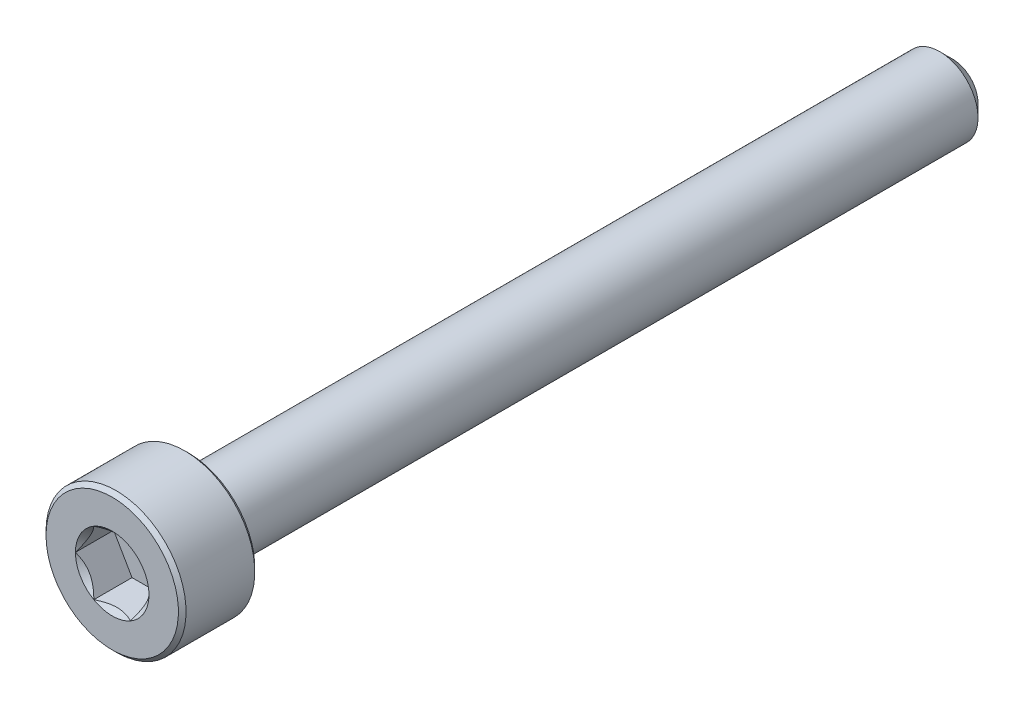
ISO-10303-21;
HEADER;
FILE_DESCRIPTION(('STEP AP214'),'2;1');
FILE_NAME('part.step','',(''),(''),'','','');
FILE_SCHEMA(('AUTOMOTIVE_DESIGN { 1 0 10303 214 1 1 1 1 }'));
ENDSEC;
DATA;
#1=APPLICATION_CONTEXT('core data for automotive mechanical design processes');
#2=APPLICATION_PROTOCOL_DEFINITION('international standard','automotive_design',2000,#1);
#3=PRODUCT_CONTEXT('',#1,'mechanical');
#4=PRODUCT('Part','Part','',(#3));
#5=PRODUCT_RELATED_PRODUCT_CATEGORY('part','',(#4));
#6=PRODUCT_DEFINITION_FORMATION('','',#4);
#7=PRODUCT_DEFINITION_CONTEXT('part definition',#1,'design');
#8=PRODUCT_DEFINITION('design','',#6,#7);
#9=PRODUCT_DEFINITION_SHAPE('','',#8);
#10=(LENGTH_UNIT() NAMED_UNIT(*) SI_UNIT(.MILLI.,.METRE.));
#11=(NAMED_UNIT(*) PLANE_ANGLE_UNIT() SI_UNIT($,.RADIAN.));
#12=(NAMED_UNIT(*) SI_UNIT($,.STERADIAN.) SOLID_ANGLE_UNIT());
#13=UNCERTAINTY_MEASURE_WITH_UNIT(LENGTH_MEASURE(1.E-05),#10,'distance_accuracy_value','');
#14=(GEOMETRIC_REPRESENTATION_CONTEXT(3) GLOBAL_UNCERTAINTY_ASSIGNED_CONTEXT((#13)) GLOBAL_UNIT_ASSIGNED_CONTEXT((#10,
#11,#12)) REPRESENTATION_CONTEXT('',''));
#15=CARTESIAN_POINT('',(0.,0.,0.));
#16=DIRECTION('',(0.,0.,1.));
#17=DIRECTION('',(1.,0.,0.));
#18=AXIS2_PLACEMENT_3D('',#15,#16,#17);
#19=CARTESIAN_POINT('',(1.44337567297406,0.,9.68118692087013));
#20=DIRECTION('',(0.866025403784439,0.5,0.));
#21=DIRECTION('',(0.,0.,-1.));
#22=AXIS2_PLACEMENT_3D('',#19,#20,#21);
#23=PLANE('',#22);
#24=DIRECTION('',(0.,0.,1.));
#25=VECTOR('',#24,1.);
#26=CARTESIAN_POINT('',(1.44337567297406,0.,9.68118692087013));
#27=LINE('',#26,#25);
#28=CARTESIAN_POINT('',(1.44337567297406,0.,15.));
#29=VERTEX_POINT('',#28);
#30=CARTESIAN_POINT('',(1.44337567297406,0.,16.5));
#31=VERTEX_POINT('',#30);
#32=EDGE_CURVE('E11',#29,#31,#27,.T.);
#33=ORIENTED_EDGE('',*,*,#32,.T.);
#34=CARTESIAN_POINT('',(1.44337567297406,0.,16.5));
#35=CARTESIAN_POINT('',(1.41857091071405,0.0429631085040134,16.475219039718));
#36=CARTESIAN_POINT('',(1.39335141059849,0.0866445640456525,16.4518937494627));
#37=CARTESIAN_POINT('',(1.34192626179312,0.175715534563347,16.4091861389099));
#38=CARTESIAN_POINT('',(1.31571572524133,0.22111351556468,16.389827573349));
#39=CARTESIAN_POINT('',(1.26286346737866,0.312656311477564,16.3566662159029));
#40=CARTESIAN_POINT('',(1.2362351986357,0.358777825857971,16.3427800967733));
#41=CARTESIAN_POINT('',(1.18239258914488,0.452035961108158,16.3213859017897));
#42=CARTESIAN_POINT('',(1.15517989206246,0.499169735065894,16.3138618619115));
#43=CARTESIAN_POINT('',(1.10827633065602,0.580409086477772,16.3070728277861));
#44=CARTESIAN_POINT('',(1.08864599684083,0.614409822015219,16.3060681886446));
#45=CARTESIAN_POINT('',(1.0494198823342,0.682351445324215,16.3077634952111));
#46=CARTESIAN_POINT('',(1.02982411023275,0.716292318217467,16.3104642592515));
#47=CARTESIAN_POINT('',(0.990821754325343,0.783846380263978,16.3194142483348));
#48=CARTESIAN_POINT('',(0.971415363536199,0.817459235102312,16.3256667730471));
#49=CARTESIAN_POINT('',(0.932926594125731,0.884123739242045,16.3413835392354));
#50=CARTESIAN_POINT('',(0.913844358232442,0.917175141331236,16.3508491588483));
#51=CARTESIAN_POINT('',(0.864994007906011,1.00178643006415,16.3789283315699));
#52=CARTESIAN_POINT('',(0.835533298508109,1.05281387556834,16.3996493450535));
#53=CARTESIAN_POINT('',(0.777764485738232,1.1528723943787,16.4463235058095));
#54=CARTESIAN_POINT('',(0.749452981901492,1.20190935746262,16.4722596212216));
#55=CARTESIAN_POINT('',(0.721687836487032,1.25,16.5));
#56=B_SPLINE_CURVE_WITH_KNOTS('',3,(#34,#35,#36,#37,#38,#39,#40,#41,#42,#43,#44,#45,#46,#47,#48,
#49,#50,#51,#52,#53,#54,#55),.UNSPECIFIED.,.F.,.F.,(4,2,2,2,2,2,2,2,2,2,4),(0.,
0.166478683225852,0.333926926832843,0.498716658518453,0.663091654628563,0.780745575560545,
0.898425484353585,1.01621489977236,1.13405490052654,1.32111591641585,1.50757565758619),.UNSPECIFIED.);
#57=CARTESIAN_POINT('',(0.721687836487031,1.25,16.5));
#58=VERTEX_POINT('',#57);
#59=EDGE_CURVE('E105',#31,#58,#56,.T.);
#60=ORIENTED_EDGE('',*,*,#59,.T.);
#61=DIRECTION('',(0.,0.,1.));
#62=VECTOR('',#61,1.);
#63=CARTESIAN_POINT('',(0.721687836487032,1.25,9.68118692087013));
#64=LINE('',#63,#62);
#65=CARTESIAN_POINT('',(0.721687836487032,1.25,15.));
#66=VERTEX_POINT('',#65);
#67=EDGE_CURVE('E90',#66,#58,#64,.T.);
#68=ORIENTED_EDGE('',*,*,#67,.F.);
#69=DIRECTION('',(0.5,-0.866025403784439,0.));
#70=VECTOR('',#69,1.);
#71=CARTESIAN_POINT('',(1.44337567297406,0.,15.));
#72=LINE('',#71,#70);
#73=EDGE_CURVE('E110',#66,#29,#72,.T.);
#74=ORIENTED_EDGE('',*,*,#73,.T.);
#75=EDGE_LOOP('',(#33,#60,#68,#74));
#76=FACE_BOUND('',#75,.T.);
#77=ADVANCED_FACE('F17',(#76),#23,.F.);
#78=CARTESIAN_POINT('',(0.721687836487031,-1.25,9.68118692087013));
#79=DIRECTION('',(0.866025403784439,-0.5,0.));
#80=DIRECTION('',(0.,0.,-1.));
#81=AXIS2_PLACEMENT_3D('',#78,#79,#80);
#82=PLANE('',#81);
#83=DIRECTION('',(0.,0.,1.));
#84=VECTOR('',#83,1.);
#85=CARTESIAN_POINT('',(0.721687836487031,-1.25,9.68118692087013));
#86=LINE('',#85,#84);
#87=CARTESIAN_POINT('',(0.721687836487031,-1.25,15.));
#88=VERTEX_POINT('',#87);
#89=CARTESIAN_POINT('',(0.721687836487031,-1.25,16.5));
#90=VERTEX_POINT('',#89);
#91=EDGE_CURVE('E34',#88,#90,#86,.T.);
#92=ORIENTED_EDGE('',*,*,#91,.T.);
#93=CARTESIAN_POINT('',(0.721687836487031,-1.25,16.5));
#94=CARTESIAN_POINT('',(0.746492598747046,-1.20703689149599,16.475219039718));
#95=CARTESIAN_POINT('',(0.771712098862606,-1.16335543595435,16.4518937494627));
#96=CARTESIAN_POINT('',(0.823137247667977,-1.07428446543665,16.4091861389099));
#97=CARTESIAN_POINT('',(0.849347784219762,-1.02888648443532,16.389827573349));
#98=CARTESIAN_POINT('',(0.902200042082436,-0.937343688522439,16.3566662159029));
#99=CARTESIAN_POINT('',(0.928828310825397,-0.891222174142032,16.3427800967733));
#100=CARTESIAN_POINT('',(0.982670920316216,-0.797964038891844,16.3213859017897));
#101=CARTESIAN_POINT('',(1.00988361739864,-0.750830264934109,16.3138618619115));
#102=CARTESIAN_POINT('',(1.05678717880508,-0.66959091352223,16.3070728277861));
#103=CARTESIAN_POINT('',(1.07641751262027,-0.635590177984783,16.3060681886446));
#104=CARTESIAN_POINT('',(1.1156436271269,-0.567648554675787,16.3077634952111));
#105=CARTESIAN_POINT('',(1.13523939922835,-0.533707681782535,16.3104642592515));
#106=CARTESIAN_POINT('',(1.17424175513575,-0.466153619736024,16.3194142483348));
#107=CARTESIAN_POINT('',(1.1936481459249,-0.432540764897689,16.3256667730471));
#108=CARTESIAN_POINT('',(1.23213691533536,-0.365876260757957,16.3413835392354));
#109=CARTESIAN_POINT('',(1.25121915122865,-0.332824858668766,16.3508491588483));
#110=CARTESIAN_POINT('',(1.30006950155508,-0.248213569935849,16.3789283315699));
#111=CARTESIAN_POINT('',(1.32953021095298,-0.19718612443166,16.3996493450535));
#112=CARTESIAN_POINT('',(1.38729902372286,-0.0971276056212983,16.4463235058095));
#113=CARTESIAN_POINT('',(1.4156105275596,-0.0480906425373827,16.4722596212216));
#114=CARTESIAN_POINT('',(1.44337567297406,0.,16.5));
#115=B_SPLINE_CURVE_WITH_KNOTS('',3,(#93,#94,#95,#96,#97,#98,#99,#100,#101,#102,#103,#104,#105,
#106,#107,#108,#109,#110,#111,#112,#113,#114),.UNSPECIFIED.,.F.,.F.,(4,2,2,2,2,2,2,2,2,2,4),(0.,
0.166478683225851,0.333926926832841,0.49871665851845,0.663091654628561,0.780745575560543,
0.898425484353584,1.01621489977236,1.13405490052654,1.32111591641584,1.5075756575862),.UNSPECIFIED.);
#116=EDGE_CURVE('E111',#90,#31,#115,.T.);
#117=ORIENTED_EDGE('',*,*,#116,.T.);
#118=ORIENTED_EDGE('',*,*,#32,.F.);
#119=DIRECTION('',(-0.5,-0.866025403784438,0.));
#120=VECTOR('',#119,1.);
#121=CARTESIAN_POINT('',(0.721687836487031,-1.25,15.));
#122=LINE('',#121,#120);
#123=EDGE_CURVE('E102',#29,#88,#122,.T.);
#124=ORIENTED_EDGE('',*,*,#123,.T.);
#125=EDGE_LOOP('',(#92,#117,#118,#124));
#126=FACE_BOUND('',#125,.T.);
#127=ADVANCED_FACE('F232',(#126),#82,.F.);
#128=CARTESIAN_POINT('',(-0.721687836487033,-1.25,9.68118692087013));
#129=DIRECTION('',(0.,-1.,0.));
#130=DIRECTION('',(-1.,0.,0.));
#131=AXIS2_PLACEMENT_3D('',#128,#129,#130);
#132=PLANE('',#131);
#133=DIRECTION('',(0.,0.,1.));
#134=VECTOR('',#133,1.);
#135=CARTESIAN_POINT('',(-0.721687836487033,-1.25,9.68118692087013));
#136=LINE('',#135,#134);
#137=CARTESIAN_POINT('',(-0.721687836487033,-1.25,15.));
#138=VERTEX_POINT('',#137);
#139=CARTESIAN_POINT('',(-0.721687836487033,-1.25,16.5));
#140=VERTEX_POINT('',#139);
#141=EDGE_CURVE('E150',#138,#140,#136,.T.);
#142=ORIENTED_EDGE('',*,*,#141,.T.);
#143=CARTESIAN_POINT('',(-0.721687836487033,-1.25,16.5));
#144=CARTESIAN_POINT('',(-0.672078311967002,-1.25,16.475219039718));
#145=CARTESIAN_POINT('',(-0.621639311735882,-1.25,16.4518937494627));
#146=CARTESIAN_POINT('',(-0.518789014125139,-1.25,16.4091861389099));
#147=CARTESIAN_POINT('',(-0.46636794102157,-1.25,16.389827573349));
#148=CARTESIAN_POINT('',(-0.360663425296221,-1.25,16.3566662159029));
#149=CARTESIAN_POINT('',(-0.307406887810299,-1.25,16.3427800967733));
#150=CARTESIAN_POINT('',(-0.199721668828662,-1.25,16.3213859017897));
#151=CARTESIAN_POINT('',(-0.145296274663819,-1.25,16.3138618619115));
#152=CARTESIAN_POINT('',(-0.0514891518509423,-1.25,16.3070728277861));
#153=CARTESIAN_POINT('',(-0.0122284842205616,-1.25,16.3060681886446));
#154=CARTESIAN_POINT('',(0.0662237447926961,-1.25,16.3077634952111));
#155=CARTESIAN_POINT('',(0.105415288995596,-1.25,16.3104642592515));
#156=CARTESIAN_POINT('',(0.183420000810408,-1.25,16.3194142483348));
#157=CARTESIAN_POINT('',(0.222232782388696,-1.25,16.3256667730471));
#158=CARTESIAN_POINT('',(0.299210321209632,-1.25,16.3413835392354));
#159=CARTESIAN_POINT('',(0.33737479299621,-1.25,16.3508491588483));
#160=CARTESIAN_POINT('',(0.435075493649071,-1.25,16.3789283315699));
#161=CARTESIAN_POINT('',(0.493996912444875,-1.25,16.3996493450535));
#162=CARTESIAN_POINT('',(0.60953453798463,-1.25,16.4463235058095));
#163=CARTESIAN_POINT('',(0.666157545658111,-1.25,16.4722596212216));
#164=CARTESIAN_POINT('',(0.721687836487031,-1.25,16.5));
#165=B_SPLINE_CURVE_WITH_KNOTS('',3,(#143,#144,#145,#146,#147,#148,#149,#150,#151,#152,#153,
#154,#155,#156,#157,#158,#159,#160,#161,#162,#163,#164),.UNSPECIFIED.,.F.,.F.,(4,2,2,2,2,2,2,2,
2,2,4),(0.,0.166478683225852,0.333926926832842,0.498716658518451,0.663091654628561,
0.780745575560543,0.898425484353584,1.01621489977236,1.13405490052654,1.32111591641584,
1.50757565758619),.UNSPECIFIED.);
#166=EDGE_CURVE('E223',#140,#90,#165,.T.);
#167=ORIENTED_EDGE('',*,*,#166,.T.);
#168=ORIENTED_EDGE('',*,*,#91,.F.);
#169=DIRECTION('',(-1.,0.,0.));
#170=VECTOR('',#169,1.);
#171=CARTESIAN_POINT('',(-0.721687836487033,-1.25,15.));
#172=LINE('',#171,#170);
#173=EDGE_CURVE('E432',#88,#138,#172,.T.);
#174=ORIENTED_EDGE('',*,*,#173,.T.);
#175=EDGE_LOOP('',(#142,#167,#168,#174));
#176=FACE_BOUND('',#175,.T.);
#177=ADVANCED_FACE('F229',(#176),#132,.F.);
#178=CARTESIAN_POINT('',(-1.44337567297406,0.,9.68118692087013));
#179=DIRECTION('',(-0.866025403784439,-0.5,0.));
#180=DIRECTION('',(-0.5,0.866025403784439,0.));
#181=AXIS2_PLACEMENT_3D('',#178,#179,#180);
#182=PLANE('',#181);
#183=DIRECTION('',(0.,0.,1.));
#184=VECTOR('',#183,1.);
#185=CARTESIAN_POINT('',(-1.44337567297406,0.,9.68118692087013));
#186=LINE('',#185,#184);
#187=CARTESIAN_POINT('',(-1.44337567297406,0.,15.));
#188=VERTEX_POINT('',#187);
#189=CARTESIAN_POINT('',(-1.44337567297406,0.,16.5));
#190=VERTEX_POINT('',#189);
#191=EDGE_CURVE('E157',#188,#190,#186,.T.);
#192=ORIENTED_EDGE('',*,*,#191,.T.);
#193=CARTESIAN_POINT('',(-1.44337567297406,0.,16.5));
#194=CARTESIAN_POINT('',(-1.41857091071405,-0.0429631085040118,16.475219039718));
#195=CARTESIAN_POINT('',(-1.39335141059849,-0.0866445640456508,16.4518937494627));
#196=CARTESIAN_POINT('',(-1.34192626179312,-0.175715534563344,16.4091861389099));
#197=CARTESIAN_POINT('',(-1.31571572524133,-0.221113515564677,16.389827573349));
#198=CARTESIAN_POINT('',(-1.26286346737866,-0.312656311477561,16.3566662159029));
#199=CARTESIAN_POINT('',(-1.2362351986357,-0.358777825857967,16.3427800967733));
#200=CARTESIAN_POINT('',(-1.18239258914488,-0.452035961108155,16.3213859017897));
#201=CARTESIAN_POINT('',(-1.15517989206246,-0.499169735065891,16.3138618619115));
#202=CARTESIAN_POINT('',(-1.10827633065602,-0.580409086477769,16.3070728277861));
#203=CARTESIAN_POINT('',(-1.08864599684083,-0.614409822015216,16.3060681886446));
#204=CARTESIAN_POINT('',(-1.0494198823342,-0.682351445324212,16.3077634952111));
#205=CARTESIAN_POINT('',(-1.02982411023275,-0.716292318217464,16.3104642592515));
#206=CARTESIAN_POINT('',(-0.990821754325344,-0.783846380263975,16.3194142483348));
#207=CARTESIAN_POINT('',(-0.9714153635362,-0.81745923510231,16.3256667730471));
#208=CARTESIAN_POINT('',(-0.932926594125732,-0.884123739242042,16.3413835392354));
#209=CARTESIAN_POINT('',(-0.913844358232443,-0.917175141331233,16.3508491588483));
#210=CARTESIAN_POINT('',(-0.864994007906013,-1.00178643006415,16.3789283315699));
#211=CARTESIAN_POINT('',(-0.83553329850811,-1.05281387556834,16.3996493450535));
#212=CARTESIAN_POINT('',(-0.777764485738232,-1.1528723943787,16.4463235058095));
#213=CARTESIAN_POINT('',(-0.749452981901492,-1.20190935746262,16.4722596212216));
#214=CARTESIAN_POINT('',(-0.721687836487032,-1.25,16.5));
#215=B_SPLINE_CURVE_WITH_KNOTS('',3,(#193,#194,#195,#196,#197,#198,#199,#200,#201,#202,#203,
#204,#205,#206,#207,#208,#209,#210,#211,#212,#213,#214),.UNSPECIFIED.,.F.,.F.,(4,2,2,2,2,2,2,2,
2,2,4),(0.,0.166478683225851,0.333926926832841,0.498716658518451,0.663091654628561,
0.780745575560544,0.898425484353584,1.01621489977236,1.13405490052654,1.32111591641584,
1.5075756575862),.UNSPECIFIED.);
#216=EDGE_CURVE('E207',#190,#140,#215,.T.);
#217=ORIENTED_EDGE('',*,*,#216,.T.);
#218=ORIENTED_EDGE('',*,*,#141,.F.);
#219=DIRECTION('',(-0.5,0.866025403784439,0.));
#220=VECTOR('',#219,1.);
#221=CARTESIAN_POINT('',(-1.44337567297406,0.,15.));
#222=LINE('',#221,#220);
#223=EDGE_CURVE('E429',#138,#188,#222,.T.);
#224=ORIENTED_EDGE('',*,*,#223,.T.);
#225=EDGE_LOOP('',(#192,#217,#218,#224));
#226=FACE_BOUND('',#225,.T.);
#227=ADVANCED_FACE('F195',(#226),#182,.F.);
#228=CARTESIAN_POINT('',(-0.721687836487032,1.25,9.68118692087013));
#229=DIRECTION('',(-0.866025403784439,0.5,0.));
#230=DIRECTION('',(0.,0.,1.));
#231=AXIS2_PLACEMENT_3D('',#228,#229,#230);
#232=PLANE('',#231);
#233=DIRECTION('',(0.,0.,1.));
#234=VECTOR('',#233,1.);
#235=CARTESIAN_POINT('',(-0.721687836487032,1.25,9.68118692087013));
#236=LINE('',#235,#234);
#237=CARTESIAN_POINT('',(-0.721687836487032,1.25,15.));
#238=VERTEX_POINT('',#237);
#239=CARTESIAN_POINT('',(-0.721687836487031,1.25,16.5));
#240=VERTEX_POINT('',#239);
#241=EDGE_CURVE('E101',#238,#240,#236,.T.);
#242=ORIENTED_EDGE('',*,*,#241,.T.);
#243=CARTESIAN_POINT('',(-0.721687836487032,1.25,16.5));
#244=CARTESIAN_POINT('',(-0.746492598747047,1.20703689149599,16.475219039718));
#245=CARTESIAN_POINT('',(-0.771712098862607,1.16335543595435,16.4518937494627));
#246=CARTESIAN_POINT('',(-0.823137247667979,1.07428446543665,16.4091861389099));
#247=CARTESIAN_POINT('',(-0.849347784219764,1.02888648443532,16.389827573349));
#248=CARTESIAN_POINT('',(-0.902200042082438,0.937343688522437,16.3566662159029));
#249=CARTESIAN_POINT('',(-0.928828310825399,0.89122217414203,16.3427800967733));
#250=CARTESIAN_POINT('',(-0.982670920316218,0.797964038891842,16.3213859017897));
#251=CARTESIAN_POINT('',(-1.00988361739864,0.750830264934106,16.3138618619115));
#252=CARTESIAN_POINT('',(-1.05678717880508,0.669590913522227,16.3070728277861));
#253=CARTESIAN_POINT('',(-1.07641751262027,0.63559017798478,16.3060681886446));
#254=CARTESIAN_POINT('',(-1.1156436271269,0.567648554675784,16.3077634952111));
#255=CARTESIAN_POINT('',(-1.13523939922835,0.533707681782532,16.3104642592515));
#256=CARTESIAN_POINT('',(-1.17424175513575,0.466153619736021,16.3194142483348));
#257=CARTESIAN_POINT('',(-1.1936481459249,0.432540764897686,16.3256667730471));
#258=CARTESIAN_POINT('',(-1.23213691533537,0.365876260757954,16.3413835392354));
#259=CARTESIAN_POINT('',(-1.25121915122865,0.332824858668762,16.3508491588483));
#260=CARTESIAN_POINT('',(-1.30006950155509,0.248213569935846,16.3789283315699));
#261=CARTESIAN_POINT('',(-1.32953021095299,0.197186124431659,16.3996493450535));
#262=CARTESIAN_POINT('',(-1.38729902372286,0.0971276056212985,16.4463235058095));
#263=CARTESIAN_POINT('',(-1.4156105275596,0.0480906425373836,16.4722596212216));
#264=CARTESIAN_POINT('',(-1.44337567297406,0.,16.5));
#265=B_SPLINE_CURVE_WITH_KNOTS('',3,(#243,#244,#245,#246,#247,#248,#249,#250,#251,#252,#253,
#254,#255,#256,#257,#258,#259,#260,#261,#262,#263,#264),.UNSPECIFIED.,.F.,.F.,(4,2,2,2,2,2,2,2,
2,2,4),(0.,0.166478683225852,0.333926926832843,0.498716658518452,0.663091654628565,
0.780745575560547,0.898425484353588,1.01621489977237,1.13405490052655,1.32111591641584,
1.50757565758619),.UNSPECIFIED.);
#266=EDGE_CURVE('E119',#240,#190,#265,.T.);
#267=ORIENTED_EDGE('',*,*,#266,.T.);
#268=ORIENTED_EDGE('',*,*,#191,.F.);
#269=DIRECTION('',(0.5,0.866025403784439,0.));
#270=VECTOR('',#269,1.);
#271=CARTESIAN_POINT('',(-0.721687836487032,1.25,15.));
#272=LINE('',#271,#270);
#273=EDGE_CURVE('E433',#188,#238,#272,.T.);
#274=ORIENTED_EDGE('',*,*,#273,.T.);
#275=EDGE_LOOP('',(#242,#267,#268,#274));
#276=FACE_BOUND('',#275,.T.);
#277=ADVANCED_FACE('F191',(#276),#232,.F.);
#278=CARTESIAN_POINT('',(0.721687836487032,1.25,9.68118692087013));
#279=DIRECTION('',(0.,1.,0.));
#280=DIRECTION('',(1.,0.,0.));
#281=AXIS2_PLACEMENT_3D('',#278,#279,#280);
#282=PLANE('',#281);
#283=ORIENTED_EDGE('',*,*,#67,.T.);
#284=CARTESIAN_POINT('',(0.721687836487031,1.25,16.5));
#285=CARTESIAN_POINT('',(0.672078311967001,1.25,16.475219039718));
#286=CARTESIAN_POINT('',(0.621639311735882,1.25,16.4518937494627));
#287=CARTESIAN_POINT('',(0.518789014125139,1.25,16.4091861389099));
#288=CARTESIAN_POINT('',(0.466367941021569,1.25,16.389827573349));
#289=CARTESIAN_POINT('',(0.360663425296221,1.25,16.3566662159029));
#290=CARTESIAN_POINT('',(0.307406887810299,1.25,16.3427800967733));
#291=CARTESIAN_POINT('',(0.199721668828662,1.25,16.3213859017897));
#292=CARTESIAN_POINT('',(0.14529627466382,1.25,16.3138618619115));
#293=CARTESIAN_POINT('',(0.0514891518509428,1.25,16.3070728277861));
#294=CARTESIAN_POINT('',(0.012228484220562,1.25,16.3060681886446));
#295=CARTESIAN_POINT('',(-0.0662237447926957,1.25,16.3077634952111));
#296=CARTESIAN_POINT('',(-0.105415288995596,1.25,16.3104642592515));
#297=CARTESIAN_POINT('',(-0.183420000810408,1.25,16.3194142483348));
#298=CARTESIAN_POINT('',(-0.222232782388696,1.25,16.3256667730471));
#299=CARTESIAN_POINT('',(-0.299210321209631,1.25,16.3413835392354));
#300=CARTESIAN_POINT('',(-0.337374792996209,1.25,16.3508491588483));
#301=CARTESIAN_POINT('',(-0.435075493649071,1.25,16.3789283315699));
#302=CARTESIAN_POINT('',(-0.493996912444875,1.25,16.3996493450535));
#303=CARTESIAN_POINT('',(-0.60953453798463,1.25,16.4463235058095));
#304=CARTESIAN_POINT('',(-0.666157545658111,1.25,16.4722596212216));
#305=CARTESIAN_POINT('',(-0.721687836487031,1.25,16.5));
#306=B_SPLINE_CURVE_WITH_KNOTS('',3,(#284,#285,#286,#287,#288,#289,#290,#291,#292,#293,#294,
#295,#296,#297,#298,#299,#300,#301,#302,#303,#304,#305),.UNSPECIFIED.,.F.,.F.,(4,2,2,2,2,2,2,2,
2,2,4),(0.,0.166478683225851,0.33392692683284,0.498716658518449,0.663091654628559,
0.780745575560541,0.898425484353582,1.01621489977236,1.13405490052654,1.32111591641584,
1.50757565758619),.UNSPECIFIED.);
#307=EDGE_CURVE('E21',#58,#240,#306,.T.);
#308=ORIENTED_EDGE('',*,*,#307,.T.);
#309=ORIENTED_EDGE('',*,*,#241,.F.);
#310=DIRECTION('',(1.,0.,0.));
#311=VECTOR('',#310,1.);
#312=CARTESIAN_POINT('',(0.721687836487032,1.25,15.));
#313=LINE('',#312,#311);
#314=EDGE_CURVE('E96',#238,#66,#313,.T.);
#315=ORIENTED_EDGE('',*,*,#314,.T.);
#316=EDGE_LOOP('',(#283,#308,#309,#315));
#317=FACE_BOUND('',#316,.T.);
#318=ADVANCED_FACE('F92',(#317),#282,.F.);
#319=CARTESIAN_POINT('',(0.,2.6,15.));
#320=DIRECTION('',(0.,0.,1.));
#321=DIRECTION('',(1.,0.,0.));
#322=AXIS2_PLACEMENT_3D('',#319,#320,#321);
#323=PLANE('',#322);
#324=ORIENTED_EDGE('',*,*,#73,.F.);
#325=ORIENTED_EDGE('',*,*,#314,.F.);
#326=ORIENTED_EDGE('',*,*,#273,.F.);
#327=ORIENTED_EDGE('',*,*,#223,.F.);
#328=ORIENTED_EDGE('',*,*,#173,.F.);
#329=ORIENTED_EDGE('',*,*,#123,.F.);
#330=EDGE_LOOP('',(#324,#325,#326,#327,#328,#329));
#331=FACE_BOUND('',#330,.T.);
#332=ADVANCED_FACE('F183',(#331),#323,.T.);
#333=CARTESIAN_POINT('',(0.,0.,16.5));
#334=DIRECTION('',(0.,0.,1.));
#335=DIRECTION('',(1.,0.,0.));
#336=AXIS2_PLACEMENT_3D('',#333,#334,#335);
#337=CONICAL_SURFACE('',#336,1.44337567297406,0.78539816339745);
#338=CARTESIAN_POINT('',(0.,0.,16.5));
#339=DIRECTION('',(0.,0.,1.));
#340=DIRECTION('',(1.,0.,0.));
#341=AXIS2_PLACEMENT_3D('',#338,#339,#340);
#342=CIRCLE('',#341,1.44337567297406);
#343=EDGE_CURVE('E125',#31,#58,#342,.T.);
#344=ORIENTED_EDGE('',*,*,#343,.T.);
#345=ORIENTED_EDGE('',*,*,#59,.F.);
#346=EDGE_LOOP('',(#344,#345));
#347=FACE_BOUND('',#346,.T.);
#348=ADVANCED_FACE('F131',(#347),#337,.F.);
#349=CARTESIAN_POINT('',(0.,0.,16.5));
#350=DIRECTION('',(0.,0.,1.));
#351=DIRECTION('',(1.,0.,0.));
#352=AXIS2_PLACEMENT_3D('',#349,#350,#351);
#353=CONICAL_SURFACE('',#352,1.44337567297406,0.78539816339745);
#354=CARTESIAN_POINT('',(0.,0.,16.5));
#355=DIRECTION('',(0.,0.,1.));
#356=DIRECTION('',(1.,0.,0.));
#357=AXIS2_PLACEMENT_3D('',#354,#355,#356);
#358=CIRCLE('',#357,1.44337567297406);
#359=EDGE_CURVE('E133',#90,#31,#358,.T.);
#360=ORIENTED_EDGE('',*,*,#359,.T.);
#361=ORIENTED_EDGE('',*,*,#116,.F.);
#362=EDGE_LOOP('',(#360,#361));
#363=FACE_BOUND('',#362,.T.);
#364=ADVANCED_FACE('F182',(#363),#353,.F.);
#365=CARTESIAN_POINT('',(0.,0.,16.5));
#366=DIRECTION('',(0.,0.,1.));
#367=DIRECTION('',(1.,0.,0.));
#368=AXIS2_PLACEMENT_3D('',#365,#366,#367);
#369=CONICAL_SURFACE('',#368,1.44337567297406,0.78539816339745);
#370=CARTESIAN_POINT('',(0.,0.,16.5));
#371=DIRECTION('',(0.,0.,1.));
#372=DIRECTION('',(1.,0.,0.));
#373=AXIS2_PLACEMENT_3D('',#370,#371,#372);
#374=CIRCLE('',#373,1.44337567297406);
#375=EDGE_CURVE('E141',#140,#90,#374,.T.);
#376=ORIENTED_EDGE('',*,*,#375,.T.);
#377=ORIENTED_EDGE('',*,*,#166,.F.);
#378=EDGE_LOOP('',(#376,#377));
#379=FACE_BOUND('',#378,.T.);
#380=ADVANCED_FACE('F219',(#379),#369,.F.);
#381=CARTESIAN_POINT('',(0.,0.,16.5));
#382=DIRECTION('',(0.,0.,1.));
#383=DIRECTION('',(1.,0.,0.));
#384=AXIS2_PLACEMENT_3D('',#381,#382,#383);
#385=CONICAL_SURFACE('',#384,1.44337567297406,0.78539816339745);
#386=CARTESIAN_POINT('',(0.,0.,16.5));
#387=DIRECTION('',(0.,0.,1.));
#388=DIRECTION('',(1.,0.,0.));
#389=AXIS2_PLACEMENT_3D('',#386,#387,#388);
#390=CIRCLE('',#389,1.44337567297406);
#391=EDGE_CURVE('E154',#190,#140,#390,.T.);
#392=ORIENTED_EDGE('',*,*,#391,.T.);
#393=ORIENTED_EDGE('',*,*,#216,.F.);
#394=EDGE_LOOP('',(#392,#393));
#395=FACE_BOUND('',#394,.T.);
#396=ADVANCED_FACE('F216',(#395),#385,.F.);
#397=CARTESIAN_POINT('',(0.,0.,16.5));
#398=DIRECTION('',(0.,0.,1.));
#399=DIRECTION('',(1.,0.,0.));
#400=AXIS2_PLACEMENT_3D('',#397,#398,#399);
#401=CONICAL_SURFACE('',#400,1.44337567297406,0.78539816339745);
#402=CARTESIAN_POINT('',(0.,0.,16.5));
#403=DIRECTION('',(0.,0.,1.));
#404=DIRECTION('',(1.,0.,0.));
#405=AXIS2_PLACEMENT_3D('',#402,#403,#404);
#406=CIRCLE('',#405,1.44337567297406);
#407=EDGE_CURVE('E128',#240,#190,#406,.T.);
#408=ORIENTED_EDGE('',*,*,#407,.T.);
#409=ORIENTED_EDGE('',*,*,#266,.F.);
#410=EDGE_LOOP('',(#408,#409));
#411=FACE_BOUND('',#410,.T.);
#412=ADVANCED_FACE('F213',(#411),#401,.F.);
#413=CARTESIAN_POINT('',(0.,0.,16.5));
#414=DIRECTION('',(0.,0.,1.));
#415=DIRECTION('',(1.,0.,0.));
#416=AXIS2_PLACEMENT_3D('',#413,#414,#415);
#417=CONICAL_SURFACE('',#416,1.44337567297406,0.78539816339745);
#418=CARTESIAN_POINT('',(0.,0.,16.5));
#419=DIRECTION('',(0.,0.,1.));
#420=DIRECTION('',(1.,0.,0.));
#421=AXIS2_PLACEMENT_3D('',#418,#419,#420);
#422=CIRCLE('',#421,1.44337567297406);
#423=EDGE_CURVE('E116',#58,#240,#422,.T.);
#424=ORIENTED_EDGE('',*,*,#423,.T.);
#425=ORIENTED_EDGE('',*,*,#307,.F.);
#426=EDGE_LOOP('',(#424,#425));
#427=FACE_BOUND('',#426,.T.);
#428=ADVANCED_FACE('F115',(#427),#417,.F.);
#429=CARTESIAN_POINT('',(0.,1.,-16.5));
#430=DIRECTION('',(0.,0.,-1.));
#431=DIRECTION('',(0.,-1.,0.));
#432=AXIS2_PLACEMENT_3D('',#429,#430,#431);
#433=PLANE('',#432);
#434=CARTESIAN_POINT('',(0.,0.,-16.5));
#435=DIRECTION('',(0.,0.,-1.));
#436=DIRECTION('',(-1.,0.,0.));
#437=AXIS2_PLACEMENT_3D('',#434,#435,#436);
#438=CIRCLE('',#437,1.);
#439=CARTESIAN_POINT('',(-1.,0.,-16.5));
#440=VERTEX_POINT('',#439);
#441=EDGE_CURVE('E398',#440,#440,#438,.T.);
#442=ORIENTED_EDGE('',*,*,#441,.T.);
#443=EDGE_LOOP('',(#442));
#444=FACE_BOUND('',#443,.T.);
#445=ADVANCED_FACE('F521',(#444),#433,.T.);
#446=CARTESIAN_POINT('',(0.,2.6,13.5));
#447=DIRECTION('',(0.,0.,-1.));
#448=DIRECTION('',(0.,-1.,0.));
#449=AXIS2_PLACEMENT_3D('',#446,#447,#448);
#450=PLANE('',#449);
#451=CARTESIAN_POINT('',(0.,0.,13.5));
#452=DIRECTION('',(0.,0.,-1.));
#453=DIRECTION('',(-1.,0.,0.));
#454=AXIS2_PLACEMENT_3D('',#451,#452,#453);
#455=CIRCLE('',#454,1.5);
#456=CARTESIAN_POINT('',(-1.5,0.,13.5));
#457=VERTEX_POINT('',#456);
#458=EDGE_CURVE('E382',#457,#457,#455,.T.);
#459=ORIENTED_EDGE('',*,*,#458,.F.);
#460=EDGE_LOOP('',(#459));
#461=FACE_BOUND('',#460,.T.);
#462=CARTESIAN_POINT('',(0.,0.,13.5));
#463=DIRECTION('',(0.,0.,-1.));
#464=DIRECTION('',(-1.,0.,0.));
#465=AXIS2_PLACEMENT_3D('',#462,#463,#464);
#466=CIRCLE('',#465,2.6);
#467=CARTESIAN_POINT('',(-2.6,0.,13.5));
#468=VERTEX_POINT('',#467);
#469=EDGE_CURVE('E374',#468,#468,#466,.T.);
#470=ORIENTED_EDGE('',*,*,#469,.T.);
#471=EDGE_LOOP('',(#470));
#472=FACE_BOUND('',#471,.T.);
#473=ADVANCED_FACE('F514',(#461,#472),#450,.T.);
#474=CARTESIAN_POINT('',(0.,2.6,16.5));
#475=DIRECTION('',(0.,0.,1.));
#476=DIRECTION('',(1.,0.,0.));
#477=AXIS2_PLACEMENT_3D('',#474,#475,#476);
#478=PLANE('',#477);
#479=ORIENTED_EDGE('',*,*,#343,.F.);
#480=ORIENTED_EDGE('',*,*,#359,.F.);
#481=ORIENTED_EDGE('',*,*,#375,.F.);
#482=ORIENTED_EDGE('',*,*,#391,.F.);
#483=ORIENTED_EDGE('',*,*,#407,.F.);
#484=ORIENTED_EDGE('',*,*,#423,.F.);
#485=EDGE_LOOP('',(#479,#480,#481,#482,#483,#484));
#486=FACE_BOUND('',#485,.T.);
#487=CARTESIAN_POINT('',(0.,0.,16.5));
#488=DIRECTION('',(0.,0.,-1.));
#489=DIRECTION('',(-1.,0.,0.));
#490=AXIS2_PLACEMENT_3D('',#487,#488,#489);
#491=CIRCLE('',#490,2.6);
#492=CARTESIAN_POINT('',(-2.6,0.,16.5));
#493=VERTEX_POINT('',#492);
#494=EDGE_CURVE('E134',#493,#493,#491,.T.);
#495=ORIENTED_EDGE('',*,*,#494,.F.);
#496=EDGE_LOOP('',(#495));
#497=FACE_BOUND('',#496,.T.);
#498=ADVANCED_FACE('F122',(#486,#497),#478,.T.);
#499=CARTESIAN_POINT('',(0.,0.,16.35));
#500=DIRECTION('',(0.,0.,-1.));
#501=DIRECTION('',(-1.,0.,0.));
#502=AXIS2_PLACEMENT_3D('',#499,#500,#501);
#503=CONICAL_SURFACE('',#502,2.75,0.785398163397457);
#504=CARTESIAN_POINT('',(0.,0.,16.35));
#505=DIRECTION('',(0.,0.,-1.));
#506=DIRECTION('',(-1.,0.,0.));
#507=AXIS2_PLACEMENT_3D('',#504,#505,#506);
#508=CIRCLE('',#507,2.75);
#509=CARTESIAN_POINT('',(-2.75,0.,16.35));
#510=VERTEX_POINT('',#509);
#511=EDGE_CURVE('E145',#510,#510,#508,.T.);
#512=ORIENTED_EDGE('',*,*,#511,.F.);
#513=EDGE_LOOP('',(#512));
#514=FACE_BOUND('',#513,.T.);
#515=ORIENTED_EDGE('',*,*,#494,.T.);
#516=EDGE_LOOP('',(#515));
#517=FACE_BOUND('',#516,.T.);
#518=ADVANCED_FACE('F287',(#514,#517),#503,.T.);
#519=CARTESIAN_POINT('',(0.,0.,-16.5));
#520=DIRECTION('',(0.,0.,-1.));
#521=DIRECTION('',(-1.,0.,0.));
#522=AXIS2_PLACEMENT_3D('',#519,#520,#521);
#523=CYLINDRICAL_SURFACE('',#522,2.75);
#524=CARTESIAN_POINT('',(0.,0.,13.65));
#525=DIRECTION('',(0.,0.,-1.));
#526=DIRECTION('',(-1.,0.,0.));
#527=AXIS2_PLACEMENT_3D('',#524,#525,#526);
#528=CIRCLE('',#527,2.75);
#529=CARTESIAN_POINT('',(-2.75,0.,13.65));
#530=VERTEX_POINT('',#529);
#531=EDGE_CURVE('E365',#530,#530,#528,.T.);
#532=ORIENTED_EDGE('',*,*,#531,.F.);
#533=EDGE_LOOP('',(#532));
#534=FACE_BOUND('',#533,.T.);
#535=ORIENTED_EDGE('',*,*,#511,.T.);
#536=EDGE_LOOP('',(#535));
#537=FACE_BOUND('',#536,.T.);
#538=ADVANCED_FACE('F293',(#534,#537),#523,.T.);
#539=CARTESIAN_POINT('',(0.,0.,13.5));
#540=DIRECTION('',(0.,0.,1.));
#541=DIRECTION('',(1.,0.,0.));
#542=AXIS2_PLACEMENT_3D('',#539,#540,#541);
#543=CONICAL_SURFACE('',#542,2.6,0.785398163397446);
#544=ORIENTED_EDGE('',*,*,#531,.T.);
#545=EDGE_LOOP('',(#544));
#546=FACE_BOUND('',#545,.T.);
#547=ORIENTED_EDGE('',*,*,#469,.F.);
#548=EDGE_LOOP('',(#547));
#549=FACE_BOUND('',#548,.T.);
#550=ADVANCED_FACE('F309',(#546,#549),#543,.T.);
#551=CARTESIAN_POINT('',(0.,0.,-16.5));
#552=DIRECTION('',(0.,0.,-1.));
#553=DIRECTION('',(-1.,0.,0.));
#554=AXIS2_PLACEMENT_3D('',#551,#552,#553);
#555=CYLINDRICAL_SURFACE('',#554,1.5);
#556=CARTESIAN_POINT('',(0.,0.,-16.));
#557=DIRECTION('',(0.,0.,-1.));
#558=DIRECTION('',(-1.,0.,0.));
#559=AXIS2_PLACEMENT_3D('',#556,#557,#558);
#560=CIRCLE('',#559,1.5);
#561=CARTESIAN_POINT('',(-1.5,0.,-16.));
#562=VERTEX_POINT('',#561);
#563=EDGE_CURVE('E390',#562,#562,#560,.T.);
#564=ORIENTED_EDGE('',*,*,#563,.F.);
#565=EDGE_LOOP('',(#564));
#566=FACE_BOUND('',#565,.T.);
#567=ORIENTED_EDGE('',*,*,#458,.T.);
#568=EDGE_LOOP('',(#567));
#569=FACE_BOUND('',#568,.T.);
#570=ADVANCED_FACE('F321',(#566,#569),#555,.T.);
#571=CARTESIAN_POINT('',(0.,0.,-16.5));
#572=DIRECTION('',(0.,0.,1.));
#573=DIRECTION('',(1.,0.,0.));
#574=AXIS2_PLACEMENT_3D('',#571,#572,#573);
#575=CONICAL_SURFACE('',#574,1.,0.785398163397442);
#576=ORIENTED_EDGE('',*,*,#563,.T.);
#577=EDGE_LOOP('',(#576));
#578=FACE_BOUND('',#577,.T.);
#579=ORIENTED_EDGE('',*,*,#441,.F.);
#580=EDGE_LOOP('',(#579));
#581=FACE_BOUND('',#580,.T.);
#582=ADVANCED_FACE('F332',(#578,#581),#575,.T.);
#583=CLOSED_SHELL('',(#77,#127,#177,#227,#277,#318,#332,#348,#364,#380,#396,#412,#428,#445,#473,
#498,#518,#538,#550,#570,#582));
#584=MANIFOLD_SOLID_BREP('B1',#583);
#585=ADVANCED_BREP_SHAPE_REPRESENTATION('',(#18,#584),#14);
#586=SHAPE_DEFINITION_REPRESENTATION(#9,#585);
ENDSEC;
END-ISO-10303-21;
